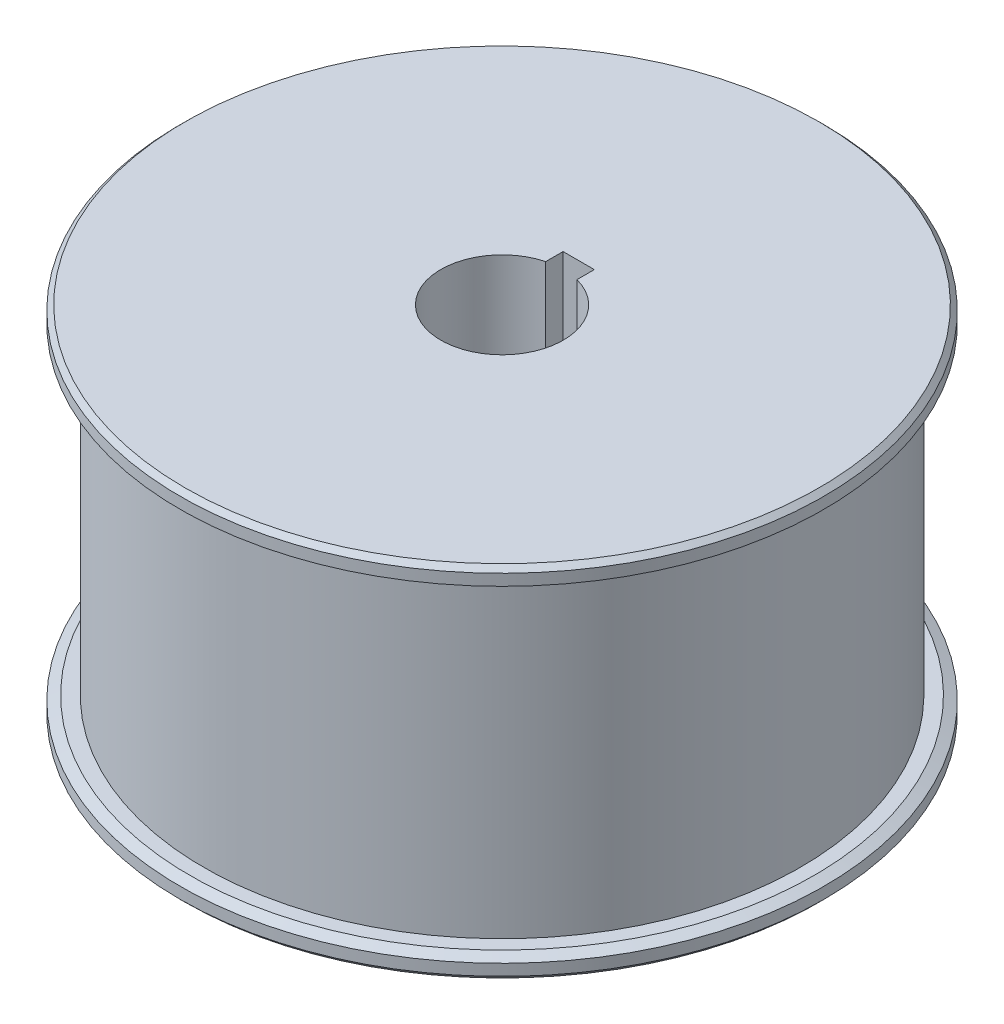
ISO-10303-21;
HEADER;
FILE_DESCRIPTION(('STEP AP214'),'2;1');
FILE_NAME('part.step','',(''),(''),'','','');
FILE_SCHEMA(('AUTOMOTIVE_DESIGN { 1 0 10303 214 1 1 1 1 }'));
ENDSEC;
DATA;
#1=APPLICATION_CONTEXT('core data for automotive mechanical design processes');
#2=APPLICATION_PROTOCOL_DEFINITION('international standard','automotive_design',2000,#1);
#3=PRODUCT_CONTEXT('',#1,'mechanical');
#4=PRODUCT('Part','Part','',(#3));
#5=PRODUCT_RELATED_PRODUCT_CATEGORY('part','',(#4));
#6=PRODUCT_DEFINITION_FORMATION('','',#4);
#7=PRODUCT_DEFINITION_CONTEXT('part definition',#1,'design');
#8=PRODUCT_DEFINITION('design','',#6,#7);
#9=PRODUCT_DEFINITION_SHAPE('','',#8);
#10=(LENGTH_UNIT() NAMED_UNIT(*) SI_UNIT(.MILLI.,.METRE.));
#11=(NAMED_UNIT(*) PLANE_ANGLE_UNIT() SI_UNIT($,.RADIAN.));
#12=(NAMED_UNIT(*) SI_UNIT($,.STERADIAN.) SOLID_ANGLE_UNIT());
#13=UNCERTAINTY_MEASURE_WITH_UNIT(LENGTH_MEASURE(1.E-05),#10,'distance_accuracy_value','');
#14=(GEOMETRIC_REPRESENTATION_CONTEXT(3) GLOBAL_UNCERTAINTY_ASSIGNED_CONTEXT((#13)) GLOBAL_UNIT_ASSIGNED_CONTEXT((#10,
#11,#12)) REPRESENTATION_CONTEXT('',''));
#15=CARTESIAN_POINT('',(0.,0.,0.));
#16=DIRECTION('',(0.,0.,1.));
#17=DIRECTION('',(1.,0.,0.));
#18=AXIS2_PLACEMENT_3D('',#15,#16,#17);
#19=CARTESIAN_POINT('',(31.035213901,2.921,0.));
#20=DIRECTION('',(0.,-1.,0.));
#21=DIRECTION('',(0.,0.,-1.));
#22=AXIS2_PLACEMENT_3D('',#19,#20,#21);
#23=PLANE('',#22);
#24=CARTESIAN_POINT('',(0.,2.921,0.));
#25=DIRECTION('',(0.,-1.,0.));
#26=DIRECTION('',(0.,0.,-1.));
#27=AXIS2_PLACEMENT_3D('',#24,#25,#26);
#28=CIRCLE('',#27,31.035213901);
#29=CARTESIAN_POINT('',(0.,2.921,-31.035213901));
#30=VERTEX_POINT('',#29);
#31=EDGE_CURVE('E123',#30,#30,#28,.F.);
#32=ORIENTED_EDGE('',*,*,#31,.F.);
#33=EDGE_LOOP('',(#32));
#34=FACE_BOUND('',#33,.T.);
#35=CARTESIAN_POINT('',(0.,2.921,0.));
#36=DIRECTION('',(0.,-1.,0.));
#37=DIRECTION('',(0.,0.,-1.));
#38=AXIS2_PLACEMENT_3D('',#35,#36,#37);
#39=CIRCLE('',#38,32.48025);
#40=CARTESIAN_POINT('',(0.,2.921,-32.48025));
#41=VERTEX_POINT('',#40);
#42=EDGE_CURVE('E20',#41,#41,#39,.T.);
#43=ORIENTED_EDGE('',*,*,#42,.F.);
#44=EDGE_LOOP('',(#43));
#45=FACE_BOUND('',#44,.T.);
#46=ADVANCED_FACE('F17',(#34,#45),#23,.F.);
#47=CARTESIAN_POINT('',(0.,2.44723141931451,0.));
#48=DIRECTION('',(0.,-1.,0.));
#49=DIRECTION('',(0.,0.,-1.));
#50=AXIS2_PLACEMENT_3D('',#47,#48,#49);
#51=CONICAL_SURFACE('',#50,33.49625,1.13446401379632);
#52=ORIENTED_EDGE('',*,*,#42,.T.);
#53=EDGE_LOOP('',(#52));
#54=FACE_BOUND('',#53,.T.);
#55=CARTESIAN_POINT('',(0.,2.44723141931451,0.));
#56=DIRECTION('',(0.,-1.,0.));
#57=DIRECTION('',(0.,0.,-1.));
#58=AXIS2_PLACEMENT_3D('',#55,#56,#57);
#59=CIRCLE('',#58,33.49625);
#60=CARTESIAN_POINT('',(0.,2.44723141931451,-33.49625));
#61=VERTEX_POINT('',#60);
#62=EDGE_CURVE('E121',#61,#61,#59,.T.);
#63=ORIENTED_EDGE('',*,*,#62,.F.);
#64=EDGE_LOOP('',(#63));
#65=FACE_BOUND('',#64,.T.);
#66=ADVANCED_FACE('F138',(#54,#65),#51,.T.);
#67=CARTESIAN_POINT('',(0.,0.,0.));
#68=DIRECTION('',(0.,-1.,0.));
#69=DIRECTION('',(0.,0.,-1.));
#70=AXIS2_PLACEMENT_3D('',#67,#68,#69);
#71=CYLINDRICAL_SURFACE('',#70,31.035213901);
#72=ORIENTED_EDGE('',*,*,#31,.T.);
#73=EDGE_LOOP('',(#72));
#74=FACE_BOUND('',#73,.T.);
#75=CARTESIAN_POINT('',(0.,35.941,0.));
#76=DIRECTION('',(0.,-1.,0.));
#77=DIRECTION('',(0.,0.,-1.));
#78=AXIS2_PLACEMENT_3D('',#75,#76,#77);
#79=CIRCLE('',#78,31.035213901);
#80=CARTESIAN_POINT('',(0.,35.941,-31.035213901));
#81=VERTEX_POINT('',#80);
#82=EDGE_CURVE('E120',#81,#81,#79,.T.);
#83=ORIENTED_EDGE('',*,*,#82,.T.);
#84=EDGE_LOOP('',(#83));
#85=FACE_BOUND('',#84,.T.);
#86=ADVANCED_FACE('F147',(#74,#85),#71,.T.);
#87=CARTESIAN_POINT('',(0.,38.1,0.));
#88=DIRECTION('',(0.,-1.,0.));
#89=DIRECTION('',(0.,0.,-1.));
#90=AXIS2_PLACEMENT_3D('',#87,#88,#89);
#91=CYLINDRICAL_SURFACE('',#90,33.49625);
#92=ORIENTED_EDGE('',*,*,#62,.T.);
#93=EDGE_LOOP('',(#92));
#94=FACE_BOUND('',#93,.T.);
#95=CARTESIAN_POINT('',(0.,1.27000000000002,0.));
#96=DIRECTION('',(0.,1.,0.));
#97=DIRECTION('',(0.,0.,1.));
#98=AXIS2_PLACEMENT_3D('',#95,#96,#97);
#99=CIRCLE('',#98,33.49625);
#100=CARTESIAN_POINT('',(0.,1.27000000000002,33.49625));
#101=VERTEX_POINT('',#100);
#102=EDGE_CURVE('E116',#101,#101,#99,.F.);
#103=ORIENTED_EDGE('',*,*,#102,.F.);
#104=EDGE_LOOP('',(#103));
#105=FACE_BOUND('',#104,.T.);
#106=ADVANCED_FACE('F187',(#94,#105),#91,.T.);
#107=CARTESIAN_POINT('',(31.035213901,35.941,0.));
#108=DIRECTION('',(0.,1.,0.));
#109=DIRECTION('',(0.,0.,1.));
#110=AXIS2_PLACEMENT_3D('',#107,#108,#109);
#111=PLANE('',#110);
#112=ORIENTED_EDGE('',*,*,#82,.F.);
#113=EDGE_LOOP('',(#112));
#114=FACE_BOUND('',#113,.T.);
#115=CARTESIAN_POINT('',(0.,35.941,0.));
#116=DIRECTION('',(0.,1.,0.));
#117=DIRECTION('',(-1.,0.,0.));
#118=AXIS2_PLACEMENT_3D('',#115,#116,#117);
#119=CIRCLE('',#118,32.48025);
#120=CARTESIAN_POINT('',(-32.48025,35.941,0.));
#121=VERTEX_POINT('',#120);
#122=EDGE_CURVE('E119',#121,#121,#119,.T.);
#123=ORIENTED_EDGE('',*,*,#122,.F.);
#124=EDGE_LOOP('',(#123));
#125=FACE_BOUND('',#124,.T.);
#126=ADVANCED_FACE('F183',(#114,#125),#111,.F.);
#127=CARTESIAN_POINT('',(0.,1.27000000000002,0.));
#128=DIRECTION('',(0.,1.,0.));
#129=DIRECTION('',(0.,0.,1.));
#130=AXIS2_PLACEMENT_3D('',#127,#128,#129);
#131=CONICAL_SURFACE('',#130,33.49625,0.785398163397454);
#132=CARTESIAN_POINT('',(0.,0.761999999999999,0.));
#133=DIRECTION('',(0.,1.,0.));
#134=DIRECTION('',(0.,0.,1.));
#135=AXIS2_PLACEMENT_3D('',#132,#133,#134);
#136=CIRCLE('',#135,32.98825);
#137=CARTESIAN_POINT('',(0.,0.761999999999999,32.98825));
#138=VERTEX_POINT('',#137);
#139=EDGE_CURVE('E115',#138,#138,#136,.T.);
#140=ORIENTED_EDGE('',*,*,#139,.T.);
#141=EDGE_LOOP('',(#140));
#142=FACE_BOUND('',#141,.T.);
#143=ORIENTED_EDGE('',*,*,#102,.T.);
#144=EDGE_LOOP('',(#143));
#145=FACE_BOUND('',#144,.T.);
#146=ADVANCED_FACE('F179',(#142,#145),#131,.T.);
#147=CARTESIAN_POINT('',(0.,36.4147685806855,0.));
#148=DIRECTION('',(0.,1.,0.));
#149=DIRECTION('',(-1.,0.,0.));
#150=AXIS2_PLACEMENT_3D('',#147,#148,#149);
#151=CONICAL_SURFACE('',#150,33.49625,1.13446401379632);
#152=CARTESIAN_POINT('',(0.,36.4147685806855,0.));
#153=DIRECTION('',(0.,-1.,0.));
#154=DIRECTION('',(0.,0.,-1.));
#155=AXIS2_PLACEMENT_3D('',#152,#153,#154);
#156=CIRCLE('',#155,33.49625);
#157=CARTESIAN_POINT('',(0.,36.4147685806855,-33.49625));
#158=VERTEX_POINT('',#157);
#159=EDGE_CURVE('E104',#158,#158,#156,.F.);
#160=ORIENTED_EDGE('',*,*,#159,.F.);
#161=EDGE_LOOP('',(#160));
#162=FACE_BOUND('',#161,.T.);
#163=ORIENTED_EDGE('',*,*,#122,.T.);
#164=EDGE_LOOP('',(#163));
#165=FACE_BOUND('',#164,.T.);
#166=ADVANCED_FACE('F176',(#162,#165),#151,.T.);
#167=CARTESIAN_POINT('',(5.08,0.762,0.));
#168=DIRECTION('',(0.,1.,0.));
#169=DIRECTION('',(0.,0.,1.));
#170=AXIS2_PLACEMENT_3D('',#167,#168,#169);
#171=PLANE('',#170);
#172=DIRECTION('',(0.,0.,1.));
#173=VECTOR('',#172,1.);
#174=CARTESIAN_POINT('',(-1.6256,0.761999999999999,-7.9756));
#175=LINE('',#174,#173);
#176=CARTESIAN_POINT('',(-1.6256,0.761999999999999,-7.9756));
#177=VERTEX_POINT('',#176);
#178=CARTESIAN_POINT('',(-1.6256,0.761999999999999,-6.16466948019113));
#179=VERTEX_POINT('',#178);
#180=EDGE_CURVE('E53',#177,#179,#175,.T.);
#181=ORIENTED_EDGE('',*,*,#180,.T.);
#182=CARTESIAN_POINT('',(0.,0.761999999999999,0.));
#183=DIRECTION('',(0.,-1.,0.));
#184=DIRECTION('',(0.,0.,-1.));
#185=AXIS2_PLACEMENT_3D('',#182,#183,#184);
#186=CIRCLE('',#185,6.3754);
#187=CARTESIAN_POINT('',(1.6256,0.761999999999999,-6.16466948019113));
#188=VERTEX_POINT('',#187);
#189=EDGE_CURVE('E94',#179,#188,#186,.F.);
#190=ORIENTED_EDGE('',*,*,#189,.T.);
#191=DIRECTION('',(0.,0.,-1.));
#192=VECTOR('',#191,1.);
#193=CARTESIAN_POINT('',(1.6256,0.761999999999999,-7.9756));
#194=LINE('',#193,#192);
#195=CARTESIAN_POINT('',(1.6256,0.761999999999999,-7.9756));
#196=VERTEX_POINT('',#195);
#197=EDGE_CURVE('E57',#188,#196,#194,.T.);
#198=ORIENTED_EDGE('',*,*,#197,.T.);
#199=DIRECTION('',(-1.,0.,0.));
#200=VECTOR('',#199,1.);
#201=CARTESIAN_POINT('',(-1.6256,0.761999999999999,-7.9756));
#202=LINE('',#201,#200);
#203=EDGE_CURVE('E69',#196,#177,#202,.T.);
#204=ORIENTED_EDGE('',*,*,#203,.T.);
#205=EDGE_LOOP('',(#181,#190,#198,#204));
#206=FACE_BOUND('',#205,.T.);
#207=ORIENTED_EDGE('',*,*,#139,.F.);
#208=EDGE_LOOP('',(#207));
#209=FACE_BOUND('',#208,.T.);
#210=ADVANCED_FACE('F172',(#206,#209),#171,.F.);
#211=CARTESIAN_POINT('',(0.,38.1,0.));
#212=DIRECTION('',(0.,-1.,0.));
#213=DIRECTION('',(0.,0.,-1.));
#214=AXIS2_PLACEMENT_3D('',#211,#212,#213);
#215=CYLINDRICAL_SURFACE('',#214,33.49625);
#216=ORIENTED_EDGE('',*,*,#159,.T.);
#217=EDGE_LOOP('',(#216));
#218=FACE_BOUND('',#217,.T.);
#219=CARTESIAN_POINT('',(0.,37.592,0.));
#220=DIRECTION('',(0.,-1.,0.));
#221=DIRECTION('',(0.,0.,-1.));
#222=AXIS2_PLACEMENT_3D('',#219,#220,#221);
#223=CIRCLE('',#222,33.49625);
#224=CARTESIAN_POINT('',(0.,37.592,-33.49625));
#225=VERTEX_POINT('',#224);
#226=EDGE_CURVE('E82',#225,#225,#223,.F.);
#227=ORIENTED_EDGE('',*,*,#226,.F.);
#228=EDGE_LOOP('',(#227));
#229=FACE_BOUND('',#228,.T.);
#230=ADVANCED_FACE('F169',(#218,#229),#215,.T.);
#231=CARTESIAN_POINT('',(-1.6256,38.1,-7.9756));
#232=DIRECTION('',(-1.,0.,0.));
#233=DIRECTION('',(0.,0.,1.));
#234=AXIS2_PLACEMENT_3D('',#231,#232,#233);
#235=PLANE('',#234);
#236=ORIENTED_EDGE('',*,*,#180,.F.);
#237=DIRECTION('',(0.,1.,0.));
#238=VECTOR('',#237,1.);
#239=CARTESIAN_POINT('',(-1.6256,38.1,-7.9756));
#240=LINE('',#239,#238);
#241=CARTESIAN_POINT('',(-1.6256,38.1,-7.9756));
#242=VERTEX_POINT('',#241);
#243=EDGE_CURVE('E62',#177,#242,#240,.T.);
#244=ORIENTED_EDGE('',*,*,#243,.T.);
#245=DIRECTION('',(0.,0.,1.));
#246=VECTOR('',#245,1.);
#247=CARTESIAN_POINT('',(-1.6256,38.1,0.));
#248=LINE('',#247,#246);
#249=CARTESIAN_POINT('',(-1.6256,38.1,-6.16466948019113));
#250=VERTEX_POINT('',#249);
#251=EDGE_CURVE('E66',#250,#242,#248,.F.);
#252=ORIENTED_EDGE('',*,*,#251,.F.);
#253=DIRECTION('',(0.,-1.,0.));
#254=VECTOR('',#253,1.);
#255=CARTESIAN_POINT('',(-1.6256,38.1,-6.16466948019113));
#256=LINE('',#255,#254);
#257=EDGE_CURVE('E85',#250,#179,#256,.T.);
#258=ORIENTED_EDGE('',*,*,#257,.T.);
#259=EDGE_LOOP('',(#236,#244,#252,#258));
#260=FACE_BOUND('',#259,.T.);
#261=ADVANCED_FACE('F64',(#260),#235,.F.);
#262=CARTESIAN_POINT('',(-1.6256,38.1,-7.9756));
#263=DIRECTION('',(0.,0.,-1.));
#264=DIRECTION('',(-1.,0.,0.));
#265=AXIS2_PLACEMENT_3D('',#262,#263,#264);
#266=PLANE('',#265);
#267=DIRECTION('',(0.,1.,0.));
#268=VECTOR('',#267,1.);
#269=CARTESIAN_POINT('',(1.6256,38.1,-7.9756));
#270=LINE('',#269,#268);
#271=CARTESIAN_POINT('',(1.6256,38.1,-7.9756));
#272=VERTEX_POINT('',#271);
#273=EDGE_CURVE('E75',#196,#272,#270,.T.);
#274=ORIENTED_EDGE('',*,*,#273,.T.);
#275=DIRECTION('',(1.,0.,0.));
#276=VECTOR('',#275,1.);
#277=CARTESIAN_POINT('',(0.,38.1,-7.9756));
#278=LINE('',#277,#276);
#279=EDGE_CURVE('E72',#242,#272,#278,.T.);
#280=ORIENTED_EDGE('',*,*,#279,.F.);
#281=ORIENTED_EDGE('',*,*,#243,.F.);
#282=ORIENTED_EDGE('',*,*,#203,.F.);
#283=EDGE_LOOP('',(#274,#280,#281,#282));
#284=FACE_BOUND('',#283,.T.);
#285=ADVANCED_FACE('F73',(#284),#266,.F.);
#286=CARTESIAN_POINT('',(1.6256,38.1,-7.9756));
#287=DIRECTION('',(1.,0.,0.));
#288=DIRECTION('',(0.,0.,-1.));
#289=AXIS2_PLACEMENT_3D('',#286,#287,#288);
#290=PLANE('',#289);
#291=DIRECTION('',(0.,0.,1.));
#292=VECTOR('',#291,1.);
#293=CARTESIAN_POINT('',(1.6256,38.1,0.));
#294=LINE('',#293,#292);
#295=CARTESIAN_POINT('',(1.6256,38.1,-6.16466948019113));
#296=VERTEX_POINT('',#295);
#297=EDGE_CURVE('E78',#272,#296,#294,.T.);
#298=ORIENTED_EDGE('',*,*,#297,.F.);
#299=ORIENTED_EDGE('',*,*,#273,.F.);
#300=ORIENTED_EDGE('',*,*,#197,.F.);
#301=DIRECTION('',(0.,-1.,0.));
#302=VECTOR('',#301,1.);
#303=CARTESIAN_POINT('',(1.6256,38.1,-6.16466948019113));
#304=LINE('',#303,#302);
#305=EDGE_CURVE('E35',#188,#296,#304,.F.);
#306=ORIENTED_EDGE('',*,*,#305,.T.);
#307=EDGE_LOOP('',(#298,#299,#300,#306));
#308=FACE_BOUND('',#307,.T.);
#309=ADVANCED_FACE('F161',(#308),#290,.F.);
#310=CARTESIAN_POINT('',(0.,38.1,0.));
#311=DIRECTION('',(0.,-1.,0.));
#312=DIRECTION('',(0.,0.,-1.));
#313=AXIS2_PLACEMENT_3D('',#310,#311,#312);
#314=CYLINDRICAL_SURFACE('',#313,6.3754);
#315=CARTESIAN_POINT('',(0.,38.1,0.));
#316=DIRECTION('',(0.,-1.,0.));
#317=DIRECTION('',(0.,0.,-1.));
#318=AXIS2_PLACEMENT_3D('',#315,#316,#317);
#319=CIRCLE('',#318,6.3754);
#320=EDGE_CURVE('E26',#296,#250,#319,.T.);
#321=ORIENTED_EDGE('',*,*,#320,.F.);
#322=ORIENTED_EDGE('',*,*,#305,.F.);
#323=ORIENTED_EDGE('',*,*,#189,.F.);
#324=ORIENTED_EDGE('',*,*,#257,.F.);
#325=EDGE_LOOP('',(#321,#322,#323,#324));
#326=FACE_BOUND('',#325,.T.);
#327=ADVANCED_FACE('F155',(#326),#314,.F.);
#328=CARTESIAN_POINT('',(0.,37.592,0.));
#329=DIRECTION('',(0.,-1.,0.));
#330=DIRECTION('',(0.,0.,-1.));
#331=AXIS2_PLACEMENT_3D('',#328,#329,#330);
#332=CONICAL_SURFACE('',#331,33.49625,0.785398163397455);
#333=ORIENTED_EDGE('',*,*,#226,.T.);
#334=EDGE_LOOP('',(#333));
#335=FACE_BOUND('',#334,.T.);
#336=CARTESIAN_POINT('',(0.,38.1,0.));
#337=DIRECTION('',(0.,-1.,0.));
#338=DIRECTION('',(0.,0.,-1.));
#339=AXIS2_PLACEMENT_3D('',#336,#337,#338);
#340=CIRCLE('',#339,32.98825);
#341=CARTESIAN_POINT('',(0.,38.1,-32.98825));
#342=VERTEX_POINT('',#341);
#343=EDGE_CURVE('E11',#342,#342,#340,.F.);
#344=ORIENTED_EDGE('',*,*,#343,.F.);
#345=EDGE_LOOP('',(#344));
#346=FACE_BOUND('',#345,.T.);
#347=ADVANCED_FACE('F149',(#335,#346),#332,.T.);
#348=CARTESIAN_POINT('',(0.,38.1,0.));
#349=DIRECTION('',(0.,1.,0.));
#350=DIRECTION('',(0.,0.,1.));
#351=AXIS2_PLACEMENT_3D('',#348,#349,#350);
#352=PLANE('',#351);
#353=ORIENTED_EDGE('',*,*,#343,.T.);
#354=EDGE_LOOP('',(#353));
#355=FACE_BOUND('',#354,.T.);
#356=ORIENTED_EDGE('',*,*,#297,.T.);
#357=ORIENTED_EDGE('',*,*,#320,.T.);
#358=ORIENTED_EDGE('',*,*,#251,.T.);
#359=ORIENTED_EDGE('',*,*,#279,.T.);
#360=EDGE_LOOP('',(#356,#357,#358,#359));
#361=FACE_BOUND('',#360,.T.);
#362=ADVANCED_FACE('F81',(#355,#361),#352,.T.);
#363=CLOSED_SHELL('',(#46,#66,#86,#106,#126,#146,#166,#210,#230,#261,#285,#309,#327,#347,#362));
#364=MANIFOLD_SOLID_BREP('B1',#363);
#365=ADVANCED_BREP_SHAPE_REPRESENTATION('',(#18,#364),#14);
#366=SHAPE_DEFINITION_REPRESENTATION(#9,#365);
ENDSEC;
END-ISO-10303-21;
